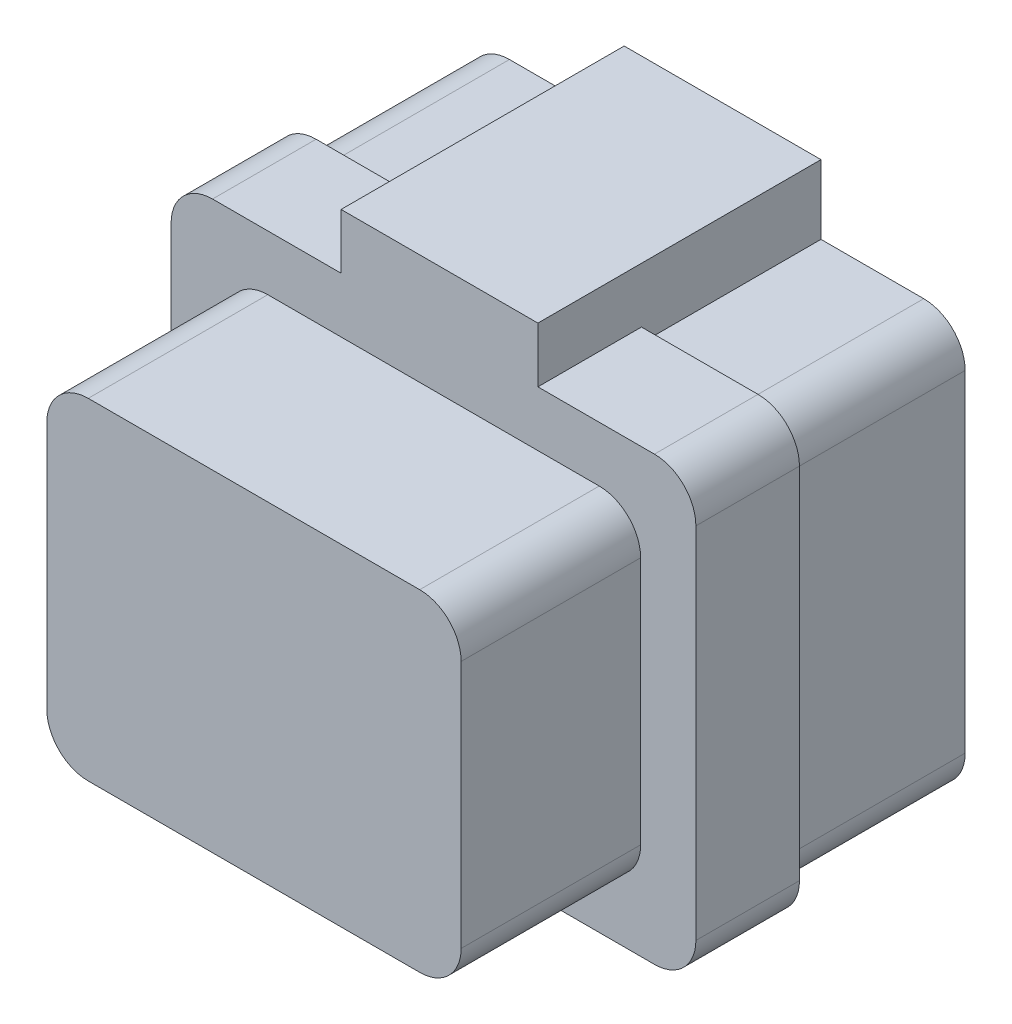
ISO-10303-21;
HEADER;
FILE_DESCRIPTION(('STEP AP214'),'2;1');
FILE_NAME('part.step','',(''),(''),'','','');
FILE_SCHEMA(('AUTOMOTIVE_DESIGN { 1 0 10303 214 1 1 1 1 }'));
ENDSEC;
DATA;
#1=APPLICATION_CONTEXT('core data for automotive mechanical design processes');
#2=APPLICATION_PROTOCOL_DEFINITION('international standard','automotive_design',2000,#1);
#3=PRODUCT_CONTEXT('',#1,'mechanical');
#4=PRODUCT('Part','Part','',(#3));
#5=PRODUCT_RELATED_PRODUCT_CATEGORY('part','',(#4));
#6=PRODUCT_DEFINITION_FORMATION('','',#4);
#7=PRODUCT_DEFINITION_CONTEXT('part definition',#1,'design');
#8=PRODUCT_DEFINITION('design','',#6,#7);
#9=PRODUCT_DEFINITION_SHAPE('','',#8);
#10=(LENGTH_UNIT() NAMED_UNIT(*) SI_UNIT(.MILLI.,.METRE.));
#11=(NAMED_UNIT(*) PLANE_ANGLE_UNIT() SI_UNIT($,.RADIAN.));
#12=(NAMED_UNIT(*) SI_UNIT($,.STERADIAN.) SOLID_ANGLE_UNIT());
#13=UNCERTAINTY_MEASURE_WITH_UNIT(LENGTH_MEASURE(1.E-05),#10,'distance_accuracy_value','');
#14=(GEOMETRIC_REPRESENTATION_CONTEXT(3) GLOBAL_UNCERTAINTY_ASSIGNED_CONTEXT((#13)) GLOBAL_UNIT_ASSIGNED_CONTEXT((#10,
#11,#12)) REPRESENTATION_CONTEXT('',''));
#15=CARTESIAN_POINT('',(0.,0.,0.));
#16=DIRECTION('',(0.,0.,1.));
#17=DIRECTION('',(1.,0.,0.));
#18=AXIS2_PLACEMENT_3D('',#15,#16,#17);
#19=CARTESIAN_POINT('',(0.,0.,0.));
#20=DIRECTION('',(0.,0.,-1.));
#21=DIRECTION('',(-1.,0.,0.));
#22=AXIS2_PLACEMENT_3D('',#19,#20,#21);
#23=PLANE('',#22);
#24=DIRECTION('',(-1.,0.,0.));
#25=VECTOR('',#24,1.);
#26=CARTESIAN_POINT('',(0.,32.,0.));
#27=LINE('',#26,#25);
#28=CARTESIAN_POINT('',(12.3077716505359,32.,0.));
#29=VERTEX_POINT('',#28);
#30=CARTESIAN_POINT('',(3.,32.,0.));
#31=VERTEX_POINT('',#30);
#32=EDGE_CURVE('E342',#29,#31,#27,.T.);
#33=ORIENTED_EDGE('',*,*,#32,.F.);
#34=DIRECTION('',(0.,-1.,0.));
#35=VECTOR('',#34,1.);
#36=CARTESIAN_POINT('',(12.3077716505359,0.,0.));
#37=LINE('',#36,#35);
#38=CARTESIAN_POINT('',(12.3077716505359,31.,0.));
#39=VERTEX_POINT('',#38);
#40=EDGE_CURVE('E267',#29,#39,#37,.T.);
#41=ORIENTED_EDGE('',*,*,#40,.T.);
#42=DIRECTION('',(1.,0.,0.));
#43=VECTOR('',#42,1.);
#44=CARTESIAN_POINT('',(1.,31.,0.));
#45=LINE('',#44,#43);
#46=CARTESIAN_POINT('',(4.,31.,0.));
#47=VERTEX_POINT('',#46);
#48=EDGE_CURVE('E292',#47,#39,#45,.T.);
#49=ORIENTED_EDGE('',*,*,#48,.F.);
#50=CARTESIAN_POINT('',(4.,28.,0.));
#51=DIRECTION('',(0.,0.,-1.));
#52=DIRECTION('',(-1.,0.,0.));
#53=AXIS2_PLACEMENT_3D('',#50,#51,#52);
#54=CIRCLE('',#53,3.);
#55=CARTESIAN_POINT('',(1.,28.,0.));
#56=VERTEX_POINT('',#55);
#57=EDGE_CURVE('E45',#47,#56,#54,.F.);
#58=ORIENTED_EDGE('',*,*,#57,.T.);
#59=DIRECTION('',(0.,1.,0.));
#60=VECTOR('',#59,1.);
#61=CARTESIAN_POINT('',(1.,1.,0.));
#62=LINE('',#61,#60);
#63=CARTESIAN_POINT('',(1.,4.,0.));
#64=VERTEX_POINT('',#63);
#65=EDGE_CURVE('E288',#64,#56,#62,.T.);
#66=ORIENTED_EDGE('',*,*,#65,.F.);
#67=CARTESIAN_POINT('',(4.,4.,0.));
#68=DIRECTION('',(0.,0.,-1.));
#69=DIRECTION('',(-1.,0.,0.));
#70=AXIS2_PLACEMENT_3D('',#67,#68,#69);
#71=CIRCLE('',#70,3.);
#72=CARTESIAN_POINT('',(4.,1.,0.));
#73=VERTEX_POINT('',#72);
#74=EDGE_CURVE('E448',#64,#73,#71,.F.);
#75=ORIENTED_EDGE('',*,*,#74,.T.);
#76=DIRECTION('',(-1.,0.,0.));
#77=VECTOR('',#76,1.);
#78=CARTESIAN_POINT('',(37.,1.,0.));
#79=LINE('',#78,#77);
#80=CARTESIAN_POINT('',(34.,1.,0.));
#81=VERTEX_POINT('',#80);
#82=EDGE_CURVE('E270',#81,#73,#79,.T.);
#83=ORIENTED_EDGE('',*,*,#82,.F.);
#84=CARTESIAN_POINT('',(34.,4.,0.));
#85=DIRECTION('',(0.,0.,-1.));
#86=DIRECTION('',(-1.,0.,0.));
#87=AXIS2_PLACEMENT_3D('',#84,#85,#86);
#88=CIRCLE('',#87,3.);
#89=CARTESIAN_POINT('',(37.,4.,0.));
#90=VERTEX_POINT('',#89);
#91=EDGE_CURVE('E446',#81,#90,#88,.F.);
#92=ORIENTED_EDGE('',*,*,#91,.T.);
#93=DIRECTION('',(0.,-1.,0.));
#94=VECTOR('',#93,1.);
#95=CARTESIAN_POINT('',(37.,31.,0.));
#96=LINE('',#95,#94);
#97=CARTESIAN_POINT('',(37.,28.,0.));
#98=VERTEX_POINT('',#97);
#99=EDGE_CURVE('E275',#98,#90,#96,.T.);
#100=ORIENTED_EDGE('',*,*,#99,.F.);
#101=CARTESIAN_POINT('',(34.,28.,0.));
#102=DIRECTION('',(0.,0.,-1.));
#103=DIRECTION('',(-1.,0.,0.));
#104=AXIS2_PLACEMENT_3D('',#101,#102,#103);
#105=CIRCLE('',#104,3.);
#106=CARTESIAN_POINT('',(34.,31.,0.));
#107=VERTEX_POINT('',#106);
#108=EDGE_CURVE('E11',#98,#107,#105,.F.);
#109=ORIENTED_EDGE('',*,*,#108,.T.);
#110=CARTESIAN_POINT('',(26.5597394318021,31.,0.));
#111=VERTEX_POINT('',#110);
#112=EDGE_CURVE('E291',#111,#107,#45,.T.);
#113=ORIENTED_EDGE('',*,*,#112,.F.);
#114=DIRECTION('',(0.,1.,0.));
#115=VECTOR('',#114,1.);
#116=CARTESIAN_POINT('',(26.5597394318021,0.,0.));
#117=LINE('',#116,#115);
#118=CARTESIAN_POINT('',(26.5597394318021,32.,0.));
#119=VERTEX_POINT('',#118);
#120=EDGE_CURVE('E259',#111,#119,#117,.T.);
#121=ORIENTED_EDGE('',*,*,#120,.T.);
#122=CARTESIAN_POINT('',(35.,32.,0.));
#123=VERTEX_POINT('',#122);
#124=EDGE_CURVE('E325',#123,#119,#27,.T.);
#125=ORIENTED_EDGE('',*,*,#124,.F.);
#126=CARTESIAN_POINT('',(35.,29.,0.));
#127=DIRECTION('',(0.,0.,-1.));
#128=DIRECTION('',(-1.,0.,0.));
#129=AXIS2_PLACEMENT_3D('',#126,#127,#128);
#130=CIRCLE('',#129,3.);
#131=CARTESIAN_POINT('',(38.,29.,0.));
#132=VERTEX_POINT('',#131);
#133=EDGE_CURVE('E395',#123,#132,#130,.T.);
#134=ORIENTED_EDGE('',*,*,#133,.T.);
#135=DIRECTION('',(0.,1.,0.));
#136=VECTOR('',#135,1.);
#137=CARTESIAN_POINT('',(38.,0.,0.));
#138=LINE('',#137,#136);
#139=CARTESIAN_POINT('',(38.,3.,0.));
#140=VERTEX_POINT('',#139);
#141=EDGE_CURVE('E339',#140,#132,#138,.T.);
#142=ORIENTED_EDGE('',*,*,#141,.F.);
#143=CARTESIAN_POINT('',(35.,3.,0.));
#144=DIRECTION('',(0.,0.,-1.));
#145=DIRECTION('',(-1.,0.,0.));
#146=AXIS2_PLACEMENT_3D('',#143,#144,#145);
#147=CIRCLE('',#146,3.);
#148=CARTESIAN_POINT('',(35.,0.,0.));
#149=VERTEX_POINT('',#148);
#150=EDGE_CURVE('E402',#140,#149,#147,.T.);
#151=ORIENTED_EDGE('',*,*,#150,.T.);
#152=DIRECTION('',(1.,0.,0.));
#153=VECTOR('',#152,1.);
#154=CARTESIAN_POINT('',(0.,0.,0.));
#155=LINE('',#154,#153);
#156=CARTESIAN_POINT('',(3.,0.,0.));
#157=VERTEX_POINT('',#156);
#158=EDGE_CURVE('E336',#157,#149,#155,.T.);
#159=ORIENTED_EDGE('',*,*,#158,.F.);
#160=CARTESIAN_POINT('',(3.,3.,0.));
#161=DIRECTION('',(0.,0.,-1.));
#162=DIRECTION('',(-1.,0.,0.));
#163=AXIS2_PLACEMENT_3D('',#160,#161,#162);
#164=CIRCLE('',#163,3.);
#165=CARTESIAN_POINT('',(0.,3.,0.));
#166=VERTEX_POINT('',#165);
#167=EDGE_CURVE('E400',#157,#166,#164,.T.);
#168=ORIENTED_EDGE('',*,*,#167,.T.);
#169=DIRECTION('',(0.,-1.,0.));
#170=VECTOR('',#169,1.);
#171=CARTESIAN_POINT('',(0.,0.,0.));
#172=LINE('',#171,#170);
#173=CARTESIAN_POINT('',(0.,29.,0.));
#174=VERTEX_POINT('',#173);
#175=EDGE_CURVE('E310',#174,#166,#172,.T.);
#176=ORIENTED_EDGE('',*,*,#175,.F.);
#177=CARTESIAN_POINT('',(3.,29.,0.));
#178=DIRECTION('',(0.,0.,-1.));
#179=DIRECTION('',(-1.,0.,0.));
#180=AXIS2_PLACEMENT_3D('',#177,#178,#179);
#181=CIRCLE('',#180,3.);
#182=EDGE_CURVE('E397',#174,#31,#181,.T.);
#183=ORIENTED_EDGE('',*,*,#182,.T.);
#184=EDGE_LOOP('',(#33,#41,#49,#58,#66,#75,#83,#92,#100,#109,#113,#121,#125,#134,#142,#151,#159,
#168,#176,#183));
#185=FACE_BOUND('',#184,.T.);
#186=ADVANCED_FACE('F37',(#185),#23,.T.);
#187=CARTESIAN_POINT('',(0.,32.,7.5));
#188=DIRECTION('',(0.,-1.,0.));
#189=DIRECTION('',(0.,0.,-1.));
#190=AXIS2_PLACEMENT_3D('',#187,#188,#189);
#191=PLANE('',#190);
#192=DIRECTION('',(0.,0.,1.));
#193=VECTOR('',#192,1.);
#194=CARTESIAN_POINT('',(12.3077716505359,32.,7.5));
#195=LINE('',#194,#193);
#196=CARTESIAN_POINT('',(12.3077716505359,32.,7.5));
#197=VERTEX_POINT('',#196);
#198=EDGE_CURVE('E256',#29,#197,#195,.T.);
#199=ORIENTED_EDGE('',*,*,#198,.F.);
#200=ORIENTED_EDGE('',*,*,#32,.T.);
#201=DIRECTION('',(0.,0.,-1.));
#202=VECTOR('',#201,1.);
#203=CARTESIAN_POINT('',(3.,32.,7.5));
#204=LINE('',#203,#202);
#205=CARTESIAN_POINT('',(3.,32.,7.5));
#206=VERTEX_POINT('',#205);
#207=EDGE_CURVE('E430',#31,#206,#204,.F.);
#208=ORIENTED_EDGE('',*,*,#207,.T.);
#209=DIRECTION('',(-1.,0.,0.));
#210=VECTOR('',#209,1.);
#211=CARTESIAN_POINT('',(0.,32.,7.5));
#212=LINE('',#211,#210);
#213=EDGE_CURVE('E60',#197,#206,#212,.T.);
#214=ORIENTED_EDGE('',*,*,#213,.F.);
#215=EDGE_LOOP('',(#199,#200,#208,#214));
#216=FACE_BOUND('',#215,.T.);
#217=ADVANCED_FACE('F499',(#216),#191,.F.);
#218=DIRECTION('',(0.,0.,-1.));
#219=VECTOR('',#218,1.);
#220=CARTESIAN_POINT('',(26.5597394318021,32.,7.5));
#221=LINE('',#220,#219);
#222=CARTESIAN_POINT('',(26.5597394318021,32.,7.5));
#223=VERTEX_POINT('',#222);
#224=EDGE_CURVE('E257',#223,#119,#221,.T.);
#225=ORIENTED_EDGE('',*,*,#224,.F.);
#226=CARTESIAN_POINT('',(35.,32.,7.5));
#227=VERTEX_POINT('',#226);
#228=EDGE_CURVE('E331',#227,#223,#212,.T.);
#229=ORIENTED_EDGE('',*,*,#228,.F.);
#230=DIRECTION('',(0.,0.,-1.));
#231=VECTOR('',#230,1.);
#232=CARTESIAN_POINT('',(35.,32.,7.5));
#233=LINE('',#232,#231);
#234=EDGE_CURVE('E427',#227,#123,#233,.T.);
#235=ORIENTED_EDGE('',*,*,#234,.T.);
#236=ORIENTED_EDGE('',*,*,#124,.T.);
#237=EDGE_LOOP('',(#225,#229,#235,#236));
#238=FACE_BOUND('',#237,.T.);
#239=ADVANCED_FACE('F504',(#238),#191,.F.);
#240=CARTESIAN_POINT('',(1.,31.,-13.));
#241=DIRECTION('',(0.,-1.,0.));
#242=DIRECTION('',(0.,0.,-1.));
#243=AXIS2_PLACEMENT_3D('',#240,#241,#242);
#244=PLANE('',#243);
#245=DIRECTION('',(0.,0.,1.));
#246=VECTOR('',#245,1.);
#247=CARTESIAN_POINT('',(12.3077716505359,31.,-13.));
#248=LINE('',#247,#246);
#249=CARTESIAN_POINT('',(12.3077716505359,31.,-13.));
#250=VERTEX_POINT('',#249);
#251=EDGE_CURVE('E467',#250,#39,#248,.T.);
#252=ORIENTED_EDGE('',*,*,#251,.F.);
#253=DIRECTION('',(1.,0.,0.));
#254=VECTOR('',#253,1.);
#255=CARTESIAN_POINT('',(1.,31.,-13.));
#256=LINE('',#255,#254);
#257=CARTESIAN_POINT('',(4.,31.,-13.));
#258=VERTEX_POINT('',#257);
#259=EDGE_CURVE('E279',#258,#250,#256,.T.);
#260=ORIENTED_EDGE('',*,*,#259,.F.);
#261=DIRECTION('',(0.,0.,1.));
#262=VECTOR('',#261,1.);
#263=CARTESIAN_POINT('',(4.,31.,-13.));
#264=LINE('',#263,#262);
#265=EDGE_CURVE('E435',#258,#47,#264,.T.);
#266=ORIENTED_EDGE('',*,*,#265,.T.);
#267=ORIENTED_EDGE('',*,*,#48,.T.);
#268=EDGE_LOOP('',(#252,#260,#266,#267));
#269=FACE_BOUND('',#268,.T.);
#270=ADVANCED_FACE('F466',(#269),#244,.F.);
#271=DIRECTION('',(0.,0.,-1.));
#272=VECTOR('',#271,1.);
#273=CARTESIAN_POINT('',(26.5597394318021,31.,-13.));
#274=LINE('',#273,#272);
#275=CARTESIAN_POINT('',(26.5597394318021,31.,-13.));
#276=VERTEX_POINT('',#275);
#277=EDGE_CURVE('E252',#111,#276,#274,.T.);
#278=ORIENTED_EDGE('',*,*,#277,.F.);
#279=ORIENTED_EDGE('',*,*,#112,.T.);
#280=DIRECTION('',(0.,0.,1.));
#281=VECTOR('',#280,1.);
#282=CARTESIAN_POINT('',(34.,31.,-13.));
#283=LINE('',#282,#281);
#284=CARTESIAN_POINT('',(34.,31.,-13.));
#285=VERTEX_POINT('',#284);
#286=EDGE_CURVE('E432',#107,#285,#283,.F.);
#287=ORIENTED_EDGE('',*,*,#286,.T.);
#288=EDGE_CURVE('E278',#276,#285,#256,.T.);
#289=ORIENTED_EDGE('',*,*,#288,.F.);
#290=EDGE_LOOP('',(#278,#279,#287,#289));
#291=FACE_BOUND('',#290,.T.);
#292=ADVANCED_FACE('F581',(#291),#244,.F.);
#293=CARTESIAN_POINT('',(0.,0.,7.5));
#294=DIRECTION('',(0.,0.,-1.));
#295=DIRECTION('',(-1.,0.,0.));
#296=AXIS2_PLACEMENT_3D('',#293,#294,#295);
#297=PLANE('',#296);
#298=ORIENTED_EDGE('',*,*,#228,.T.);
#299=DIRECTION('',(0.,-1.,0.));
#300=VECTOR('',#299,1.);
#301=CARTESIAN_POINT('',(26.5597394318021,36.,7.5));
#302=LINE('',#301,#300);
#303=CARTESIAN_POINT('',(26.5597394318021,36.,7.5));
#304=VERTEX_POINT('',#303);
#305=EDGE_CURVE('E241',#304,#223,#302,.T.);
#306=ORIENTED_EDGE('',*,*,#305,.F.);
#307=DIRECTION('',(1.,0.,0.));
#308=VECTOR('',#307,1.);
#309=CARTESIAN_POINT('',(12.3077716505359,36.,7.5));
#310=LINE('',#309,#308);
#311=CARTESIAN_POINT('',(12.3077716505359,36.,7.5));
#312=VERTEX_POINT('',#311);
#313=EDGE_CURVE('E234',#312,#304,#310,.T.);
#314=ORIENTED_EDGE('',*,*,#313,.F.);
#315=DIRECTION('',(0.,-1.,0.));
#316=VECTOR('',#315,1.);
#317=CARTESIAN_POINT('',(12.3077716505359,36.,7.5));
#318=LINE('',#317,#316);
#319=EDGE_CURVE('E240',#312,#197,#318,.T.);
#320=ORIENTED_EDGE('',*,*,#319,.T.);
#321=ORIENTED_EDGE('',*,*,#213,.T.);
#322=CARTESIAN_POINT('',(3.,29.,7.5));
#323=DIRECTION('',(0.,0.,-1.));
#324=DIRECTION('',(-1.,0.,0.));
#325=AXIS2_PLACEMENT_3D('',#322,#323,#324);
#326=CIRCLE('',#325,3.);
#327=CARTESIAN_POINT('',(0.,29.,7.5));
#328=VERTEX_POINT('',#327);
#329=EDGE_CURVE('E411',#206,#328,#326,.F.);
#330=ORIENTED_EDGE('',*,*,#329,.T.);
#331=DIRECTION('',(0.,-1.,0.));
#332=VECTOR('',#331,1.);
#333=CARTESIAN_POINT('',(0.,0.,7.5));
#334=LINE('',#333,#332);
#335=CARTESIAN_POINT('',(0.,3.,7.5));
#336=VERTEX_POINT('',#335);
#337=EDGE_CURVE('E321',#328,#336,#334,.T.);
#338=ORIENTED_EDGE('',*,*,#337,.T.);
#339=CARTESIAN_POINT('',(3.,3.,7.5));
#340=DIRECTION('',(0.,0.,-1.));
#341=DIRECTION('',(-1.,0.,0.));
#342=AXIS2_PLACEMENT_3D('',#339,#340,#341);
#343=CIRCLE('',#342,3.);
#344=CARTESIAN_POINT('',(3.,0.,7.5));
#345=VERTEX_POINT('',#344);
#346=EDGE_CURVE('E413',#336,#345,#343,.F.);
#347=ORIENTED_EDGE('',*,*,#346,.T.);
#348=DIRECTION('',(1.,0.,0.));
#349=VECTOR('',#348,1.);
#350=CARTESIAN_POINT('',(0.,0.,7.5));
#351=LINE('',#350,#349);
#352=CARTESIAN_POINT('',(35.,0.,7.5));
#353=VERTEX_POINT('',#352);
#354=EDGE_CURVE('E324',#345,#353,#351,.T.);
#355=ORIENTED_EDGE('',*,*,#354,.T.);
#356=CARTESIAN_POINT('',(35.,3.,7.5));
#357=DIRECTION('',(0.,0.,-1.));
#358=DIRECTION('',(-1.,0.,0.));
#359=AXIS2_PLACEMENT_3D('',#356,#357,#358);
#360=CIRCLE('',#359,3.);
#361=CARTESIAN_POINT('',(38.,3.,7.5));
#362=VERTEX_POINT('',#361);
#363=EDGE_CURVE('E415',#353,#362,#360,.F.);
#364=ORIENTED_EDGE('',*,*,#363,.T.);
#365=DIRECTION('',(0.,1.,0.));
#366=VECTOR('',#365,1.);
#367=CARTESIAN_POINT('',(38.,0.,7.5));
#368=LINE('',#367,#366);
#369=CARTESIAN_POINT('',(38.,29.,7.5));
#370=VERTEX_POINT('',#369);
#371=EDGE_CURVE('E328',#362,#370,#368,.T.);
#372=ORIENTED_EDGE('',*,*,#371,.T.);
#373=CARTESIAN_POINT('',(35.,29.,7.5));
#374=DIRECTION('',(0.,0.,-1.));
#375=DIRECTION('',(-1.,0.,0.));
#376=AXIS2_PLACEMENT_3D('',#373,#374,#375);
#377=CIRCLE('',#376,3.);
#378=EDGE_CURVE('E409',#370,#227,#377,.F.);
#379=ORIENTED_EDGE('',*,*,#378,.T.);
#380=EDGE_LOOP('',(#298,#306,#314,#320,#321,#330,#338,#347,#355,#364,#372,#379));
#381=FACE_BOUND('',#380,.T.);
#382=DIRECTION('',(-1.,0.,0.));
#383=VECTOR('',#382,1.);
#384=CARTESIAN_POINT('',(34.,28.,7.5));
#385=LINE('',#384,#383);
#386=CARTESIAN_POINT('',(31.,28.,7.5));
#387=VERTEX_POINT('',#386);
#388=CARTESIAN_POINT('',(7.00000000000001,28.,7.5));
#389=VERTEX_POINT('',#388);
#390=EDGE_CURVE('E285',#387,#389,#385,.T.);
#391=ORIENTED_EDGE('',*,*,#390,.F.);
#392=CARTESIAN_POINT('',(31.,25.,7.5));
#393=DIRECTION('',(0.,0.,-1.));
#394=DIRECTION('',(-1.,0.,0.));
#395=AXIS2_PLACEMENT_3D('',#392,#393,#394);
#396=CIRCLE('',#395,3.);
#397=CARTESIAN_POINT('',(34.,25.,7.5));
#398=VERTEX_POINT('',#397);
#399=EDGE_CURVE('E444',#387,#398,#396,.T.);
#400=ORIENTED_EDGE('',*,*,#399,.T.);
#401=DIRECTION('',(0.,1.,0.));
#402=VECTOR('',#401,1.);
#403=CARTESIAN_POINT('',(34.,4.,7.5));
#404=LINE('',#403,#402);
#405=CARTESIAN_POINT('',(34.,7.,7.5));
#406=VERTEX_POINT('',#405);
#407=EDGE_CURVE('E301',#406,#398,#404,.T.);
#408=ORIENTED_EDGE('',*,*,#407,.F.);
#409=CARTESIAN_POINT('',(31.,7.,7.5));
#410=DIRECTION('',(0.,0.,-1.));
#411=DIRECTION('',(-1.,0.,0.));
#412=AXIS2_PLACEMENT_3D('',#409,#410,#411);
#413=CIRCLE('',#412,3.);
#414=CARTESIAN_POINT('',(31.,4.,7.5));
#415=VERTEX_POINT('',#414);
#416=EDGE_CURVE('E438',#406,#415,#413,.T.);
#417=ORIENTED_EDGE('',*,*,#416,.T.);
#418=DIRECTION('',(1.,0.,0.));
#419=VECTOR('',#418,1.);
#420=CARTESIAN_POINT('',(4.,4.,7.5));
#421=LINE('',#420,#419);
#422=CARTESIAN_POINT('',(7.,4.,7.5));
#423=VERTEX_POINT('',#422);
#424=EDGE_CURVE('E316',#423,#415,#421,.T.);
#425=ORIENTED_EDGE('',*,*,#424,.F.);
#426=CARTESIAN_POINT('',(7.,7.,7.5));
#427=DIRECTION('',(0.,0.,-1.));
#428=DIRECTION('',(-1.,0.,0.));
#429=AXIS2_PLACEMENT_3D('',#426,#427,#428);
#430=CIRCLE('',#429,3.);
#431=CARTESIAN_POINT('',(4.,7.,7.5));
#432=VERTEX_POINT('',#431);
#433=EDGE_CURVE('E440',#423,#432,#430,.T.);
#434=ORIENTED_EDGE('',*,*,#433,.T.);
#435=DIRECTION('',(0.,-1.,0.));
#436=VECTOR('',#435,1.);
#437=CARTESIAN_POINT('',(4.,28.,7.5));
#438=LINE('',#437,#436);
#439=CARTESIAN_POINT('',(4.,25.,7.5));
#440=VERTEX_POINT('',#439);
#441=EDGE_CURVE('E313',#440,#432,#438,.T.);
#442=ORIENTED_EDGE('',*,*,#441,.F.);
#443=CARTESIAN_POINT('',(7.,25.,7.5));
#444=DIRECTION('',(0.,0.,-1.));
#445=DIRECTION('',(-1.,0.,0.));
#446=AXIS2_PLACEMENT_3D('',#443,#444,#445);
#447=CIRCLE('',#446,3.);
#448=EDGE_CURVE('E442',#440,#389,#447,.T.);
#449=ORIENTED_EDGE('',*,*,#448,.T.);
#450=EDGE_LOOP('',(#391,#400,#408,#417,#425,#434,#442,#449));
#451=FACE_BOUND('',#450,.T.);
#452=ADVANCED_FACE('F237',(#381,#451),#297,.F.);
#453=CARTESIAN_POINT('',(0.,0.,7.5));
#454=DIRECTION('',(1.,0.,0.));
#455=DIRECTION('',(0.,0.,-1.));
#456=AXIS2_PLACEMENT_3D('',#453,#454,#455);
#457=PLANE('',#456);
#458=ORIENTED_EDGE('',*,*,#175,.T.);
#459=DIRECTION('',(0.,0.,-1.));
#460=VECTOR('',#459,1.);
#461=CARTESIAN_POINT('',(0.,3.,7.5));
#462=LINE('',#461,#460);
#463=EDGE_CURVE('E420',#166,#336,#462,.F.);
#464=ORIENTED_EDGE('',*,*,#463,.T.);
#465=ORIENTED_EDGE('',*,*,#337,.F.);
#466=DIRECTION('',(0.,0.,-1.));
#467=VECTOR('',#466,1.);
#468=CARTESIAN_POINT('',(0.,29.,7.5));
#469=LINE('',#468,#467);
#470=EDGE_CURVE('E417',#328,#174,#469,.T.);
#471=ORIENTED_EDGE('',*,*,#470,.T.);
#472=EDGE_LOOP('',(#458,#464,#465,#471));
#473=FACE_BOUND('',#472,.T.);
#474=ADVANCED_FACE('F518',(#473),#457,.F.);
#475=CARTESIAN_POINT('',(0.,0.,7.5));
#476=DIRECTION('',(0.,1.,0.));
#477=DIRECTION('',(0.,0.,1.));
#478=AXIS2_PLACEMENT_3D('',#475,#476,#477);
#479=PLANE('',#478);
#480=ORIENTED_EDGE('',*,*,#158,.T.);
#481=DIRECTION('',(0.,0.,-1.));
#482=VECTOR('',#481,1.);
#483=CARTESIAN_POINT('',(35.,0.,7.5));
#484=LINE('',#483,#482);
#485=EDGE_CURVE('E407',#149,#353,#484,.F.);
#486=ORIENTED_EDGE('',*,*,#485,.T.);
#487=ORIENTED_EDGE('',*,*,#354,.F.);
#488=DIRECTION('',(0.,0.,-1.));
#489=VECTOR('',#488,1.);
#490=CARTESIAN_POINT('',(3.,0.,7.5));
#491=LINE('',#490,#489);
#492=EDGE_CURVE('E404',#345,#157,#491,.T.);
#493=ORIENTED_EDGE('',*,*,#492,.T.);
#494=EDGE_LOOP('',(#480,#486,#487,#493));
#495=FACE_BOUND('',#494,.T.);
#496=ADVANCED_FACE('F514',(#495),#479,.F.);
#497=CARTESIAN_POINT('',(38.,0.,7.5));
#498=DIRECTION('',(-1.,0.,0.));
#499=DIRECTION('',(0.,0.,1.));
#500=AXIS2_PLACEMENT_3D('',#497,#498,#499);
#501=PLANE('',#500);
#502=ORIENTED_EDGE('',*,*,#371,.F.);
#503=DIRECTION('',(0.,0.,-1.));
#504=VECTOR('',#503,1.);
#505=CARTESIAN_POINT('',(38.,3.,7.5));
#506=LINE('',#505,#504);
#507=EDGE_CURVE('E392',#362,#140,#506,.T.);
#508=ORIENTED_EDGE('',*,*,#507,.T.);
#509=ORIENTED_EDGE('',*,*,#141,.T.);
#510=DIRECTION('',(0.,0.,-1.));
#511=VECTOR('',#510,1.);
#512=CARTESIAN_POINT('',(38.,29.,7.5));
#513=LINE('',#512,#511);
#514=EDGE_CURVE('E390',#132,#370,#513,.F.);
#515=ORIENTED_EDGE('',*,*,#514,.T.);
#516=EDGE_LOOP('',(#502,#508,#509,#515));
#517=FACE_BOUND('',#516,.T.);
#518=ADVANCED_FACE('F510',(#517),#501,.F.);
#519=CARTESIAN_POINT('',(34.,28.,20.5));
#520=DIRECTION('',(0.,-1.,0.));
#521=DIRECTION('',(0.,0.,-1.));
#522=AXIS2_PLACEMENT_3D('',#519,#520,#521);
#523=PLANE('',#522);
#524=ORIENTED_EDGE('',*,*,#390,.T.);
#525=DIRECTION('',(0.,0.,-1.));
#526=VECTOR('',#525,1.);
#527=CARTESIAN_POINT('',(7.,28.,20.5));
#528=LINE('',#527,#526);
#529=CARTESIAN_POINT('',(7.00000000000001,28.,20.5));
#530=VERTEX_POINT('',#529);
#531=EDGE_CURVE('E370',#389,#530,#528,.F.);
#532=ORIENTED_EDGE('',*,*,#531,.T.);
#533=DIRECTION('',(-1.,0.,0.));
#534=VECTOR('',#533,1.);
#535=CARTESIAN_POINT('',(34.,28.,20.5));
#536=LINE('',#535,#534);
#537=CARTESIAN_POINT('',(31.,28.,20.5));
#538=VERTEX_POINT('',#537);
#539=EDGE_CURVE('E297',#538,#530,#536,.T.);
#540=ORIENTED_EDGE('',*,*,#539,.F.);
#541=DIRECTION('',(0.,0.,-1.));
#542=VECTOR('',#541,1.);
#543=CARTESIAN_POINT('',(31.,28.,20.5));
#544=LINE('',#543,#542);
#545=EDGE_CURVE('E367',#538,#387,#544,.T.);
#546=ORIENTED_EDGE('',*,*,#545,.T.);
#547=EDGE_LOOP('',(#524,#532,#540,#546));
#548=FACE_BOUND('',#547,.T.);
#549=ADVANCED_FACE('F513',(#548),#523,.F.);
#550=CARTESIAN_POINT('',(4.,28.,20.5));
#551=DIRECTION('',(1.,0.,0.));
#552=DIRECTION('',(0.,0.,-1.));
#553=AXIS2_PLACEMENT_3D('',#550,#551,#552);
#554=PLANE('',#553);
#555=ORIENTED_EDGE('',*,*,#441,.T.);
#556=DIRECTION('',(0.,0.,-1.));
#557=VECTOR('',#556,1.);
#558=CARTESIAN_POINT('',(4.,7.,20.5));
#559=LINE('',#558,#557);
#560=CARTESIAN_POINT('',(4.,7.,20.5));
#561=VERTEX_POINT('',#560);
#562=EDGE_CURVE('E365',#432,#561,#559,.F.);
#563=ORIENTED_EDGE('',*,*,#562,.T.);
#564=DIRECTION('',(0.,-1.,0.));
#565=VECTOR('',#564,1.);
#566=CARTESIAN_POINT('',(4.,28.,20.5));
#567=LINE('',#566,#565);
#568=CARTESIAN_POINT('',(4.,25.,20.5));
#569=VERTEX_POINT('',#568);
#570=EDGE_CURVE('E300',#569,#561,#567,.T.);
#571=ORIENTED_EDGE('',*,*,#570,.F.);
#572=DIRECTION('',(0.,0.,-1.));
#573=VECTOR('',#572,1.);
#574=CARTESIAN_POINT('',(4.,25.,20.5));
#575=LINE('',#574,#573);
#576=EDGE_CURVE('E362',#569,#440,#575,.T.);
#577=ORIENTED_EDGE('',*,*,#576,.T.);
#578=EDGE_LOOP('',(#555,#563,#571,#577));
#579=FACE_BOUND('',#578,.T.);
#580=ADVANCED_FACE('F629',(#579),#554,.F.);
#581=CARTESIAN_POINT('',(4.,4.,20.5));
#582=DIRECTION('',(0.,1.,0.));
#583=DIRECTION('',(0.,0.,1.));
#584=AXIS2_PLACEMENT_3D('',#581,#582,#583);
#585=PLANE('',#584);
#586=ORIENTED_EDGE('',*,*,#424,.T.);
#587=DIRECTION('',(0.,0.,-1.));
#588=VECTOR('',#587,1.);
#589=CARTESIAN_POINT('',(31.,4.,20.5));
#590=LINE('',#589,#588);
#591=CARTESIAN_POINT('',(31.,4.,20.5));
#592=VERTEX_POINT('',#591);
#593=EDGE_CURVE('E352',#415,#592,#590,.F.);
#594=ORIENTED_EDGE('',*,*,#593,.T.);
#595=DIRECTION('',(1.,0.,0.));
#596=VECTOR('',#595,1.);
#597=CARTESIAN_POINT('',(4.,4.,20.5));
#598=LINE('',#597,#596);
#599=CARTESIAN_POINT('',(7.,4.,20.5));
#600=VERTEX_POINT('',#599);
#601=EDGE_CURVE('E304',#600,#592,#598,.T.);
#602=ORIENTED_EDGE('',*,*,#601,.F.);
#603=DIRECTION('',(0.,0.,-1.));
#604=VECTOR('',#603,1.);
#605=CARTESIAN_POINT('',(7.,4.,20.5));
#606=LINE('',#605,#604);
#607=EDGE_CURVE('E349',#600,#423,#606,.T.);
#608=ORIENTED_EDGE('',*,*,#607,.T.);
#609=EDGE_LOOP('',(#586,#594,#602,#608));
#610=FACE_BOUND('',#609,.T.);
#611=ADVANCED_FACE('F625',(#610),#585,.F.);
#612=CARTESIAN_POINT('',(34.,4.,20.5));
#613=DIRECTION('',(-1.,0.,0.));
#614=DIRECTION('',(0.,0.,1.));
#615=AXIS2_PLACEMENT_3D('',#612,#613,#614);
#616=PLANE('',#615);
#617=DIRECTION('',(0.,1.,0.));
#618=VECTOR('',#617,1.);
#619=CARTESIAN_POINT('',(34.,4.,20.5));
#620=LINE('',#619,#618);
#621=CARTESIAN_POINT('',(34.,7.,20.5));
#622=VERTEX_POINT('',#621);
#623=CARTESIAN_POINT('',(34.,25.,20.5));
#624=VERTEX_POINT('',#623);
#625=EDGE_CURVE('E307',#622,#624,#620,.T.);
#626=ORIENTED_EDGE('',*,*,#625,.F.);
#627=DIRECTION('',(0.,0.,-1.));
#628=VECTOR('',#627,1.);
#629=CARTESIAN_POINT('',(34.,7.,20.5));
#630=LINE('',#629,#628);
#631=EDGE_CURVE('E346',#622,#406,#630,.T.);
#632=ORIENTED_EDGE('',*,*,#631,.T.);
#633=ORIENTED_EDGE('',*,*,#407,.T.);
#634=DIRECTION('',(0.,0.,-1.));
#635=VECTOR('',#634,1.);
#636=CARTESIAN_POINT('',(34.,25.,20.5));
#637=LINE('',#636,#635);
#638=EDGE_CURVE('E333',#398,#624,#637,.F.);
#639=ORIENTED_EDGE('',*,*,#638,.T.);
#640=EDGE_LOOP('',(#626,#632,#633,#639));
#641=FACE_BOUND('',#640,.T.);
#642=ADVANCED_FACE('F621',(#641),#616,.F.);
#643=CARTESIAN_POINT('',(0.,0.,20.5));
#644=DIRECTION('',(0.,0.,1.));
#645=DIRECTION('',(1.,0.,0.));
#646=AXIS2_PLACEMENT_3D('',#643,#644,#645);
#647=PLANE('',#646);
#648=ORIENTED_EDGE('',*,*,#601,.T.);
#649=CARTESIAN_POINT('',(31.,7.,20.5));
#650=DIRECTION('',(0.,0.,1.));
#651=DIRECTION('',(1.,0.,0.));
#652=AXIS2_PLACEMENT_3D('',#649,#650,#651);
#653=CIRCLE('',#652,3.);
#654=EDGE_CURVE('E360',#592,#622,#653,.T.);
#655=ORIENTED_EDGE('',*,*,#654,.T.);
#656=ORIENTED_EDGE('',*,*,#625,.T.);
#657=CARTESIAN_POINT('',(31.,25.,20.5));
#658=DIRECTION('',(0.,0.,1.));
#659=DIRECTION('',(1.,0.,0.));
#660=AXIS2_PLACEMENT_3D('',#657,#658,#659);
#661=CIRCLE('',#660,3.);
#662=EDGE_CURVE('E354',#624,#538,#661,.T.);
#663=ORIENTED_EDGE('',*,*,#662,.T.);
#664=ORIENTED_EDGE('',*,*,#539,.T.);
#665=CARTESIAN_POINT('',(7.,25.,20.5));
#666=DIRECTION('',(0.,0.,1.));
#667=DIRECTION('',(1.,0.,0.));
#668=AXIS2_PLACEMENT_3D('',#665,#666,#667);
#669=CIRCLE('',#668,3.);
#670=EDGE_CURVE('E356',#530,#569,#669,.T.);
#671=ORIENTED_EDGE('',*,*,#670,.T.);
#672=ORIENTED_EDGE('',*,*,#570,.T.);
#673=CARTESIAN_POINT('',(7.,7.,20.5));
#674=DIRECTION('',(0.,0.,1.));
#675=DIRECTION('',(1.,0.,0.));
#676=AXIS2_PLACEMENT_3D('',#673,#674,#675);
#677=CIRCLE('',#676,3.);
#678=EDGE_CURVE('E358',#561,#600,#677,.T.);
#679=ORIENTED_EDGE('',*,*,#678,.T.);
#680=EDGE_LOOP('',(#648,#655,#656,#663,#664,#671,#672,#679));
#681=FACE_BOUND('',#680,.T.);
#682=ADVANCED_FACE('F618',(#681),#647,.T.);
#683=CARTESIAN_POINT('',(37.,1.,-13.));
#684=DIRECTION('',(0.,1.,0.));
#685=DIRECTION('',(0.,0.,1.));
#686=AXIS2_PLACEMENT_3D('',#683,#684,#685);
#687=PLANE('',#686);
#688=DIRECTION('',(-1.,0.,0.));
#689=VECTOR('',#688,1.);
#690=CARTESIAN_POINT('',(37.,1.,-13.));
#691=LINE('',#690,#689);
#692=CARTESIAN_POINT('',(34.,1.,-13.));
#693=VERTEX_POINT('',#692);
#694=CARTESIAN_POINT('',(4.,1.,-13.));
#695=VERTEX_POINT('',#694);
#696=EDGE_CURVE('E271',#693,#695,#691,.T.);
#697=ORIENTED_EDGE('',*,*,#696,.F.);
#698=DIRECTION('',(0.,0.,1.));
#699=VECTOR('',#698,1.);
#700=CARTESIAN_POINT('',(34.,1.,-13.));
#701=LINE('',#700,#699);
#702=EDGE_CURVE('E374',#693,#81,#701,.T.);
#703=ORIENTED_EDGE('',*,*,#702,.T.);
#704=ORIENTED_EDGE('',*,*,#82,.T.);
#705=DIRECTION('',(0.,0.,1.));
#706=VECTOR('',#705,1.);
#707=CARTESIAN_POINT('',(4.,1.,-13.));
#708=LINE('',#707,#706);
#709=EDGE_CURVE('E372',#73,#695,#708,.F.);
#710=ORIENTED_EDGE('',*,*,#709,.T.);
#711=EDGE_LOOP('',(#697,#703,#704,#710));
#712=FACE_BOUND('',#711,.T.);
#713=ADVANCED_FACE('F574',(#712),#687,.F.);
#714=CARTESIAN_POINT('',(1.,1.,-13.));
#715=DIRECTION('',(1.,0.,0.));
#716=DIRECTION('',(0.,0.,-1.));
#717=AXIS2_PLACEMENT_3D('',#714,#715,#716);
#718=PLANE('',#717);
#719=DIRECTION('',(0.,1.,0.));
#720=VECTOR('',#719,1.);
#721=CARTESIAN_POINT('',(1.,1.,-13.));
#722=LINE('',#721,#720);
#723=CARTESIAN_POINT('',(1.,4.,-13.));
#724=VERTEX_POINT('',#723);
#725=CARTESIAN_POINT('',(1.,28.,-13.));
#726=VERTEX_POINT('',#725);
#727=EDGE_CURVE('E274',#724,#726,#722,.T.);
#728=ORIENTED_EDGE('',*,*,#727,.F.);
#729=DIRECTION('',(0.,0.,1.));
#730=VECTOR('',#729,1.);
#731=CARTESIAN_POINT('',(1.,4.,-13.));
#732=LINE('',#731,#730);
#733=EDGE_CURVE('E424',#724,#64,#732,.T.);
#734=ORIENTED_EDGE('',*,*,#733,.T.);
#735=ORIENTED_EDGE('',*,*,#65,.T.);
#736=DIRECTION('',(0.,0.,1.));
#737=VECTOR('',#736,1.);
#738=CARTESIAN_POINT('',(1.,28.,-13.));
#739=LINE('',#738,#737);
#740=EDGE_CURVE('E422',#56,#726,#739,.F.);
#741=ORIENTED_EDGE('',*,*,#740,.T.);
#742=EDGE_LOOP('',(#728,#734,#735,#741));
#743=FACE_BOUND('',#742,.T.);
#744=ADVANCED_FACE('F458',(#743),#718,.F.);
#745=CARTESIAN_POINT('',(37.,31.,-13.));
#746=DIRECTION('',(-1.,0.,0.));
#747=DIRECTION('',(0.,0.,1.));
#748=AXIS2_PLACEMENT_3D('',#745,#746,#747);
#749=PLANE('',#748);
#750=ORIENTED_EDGE('',*,*,#99,.T.);
#751=DIRECTION('',(0.,0.,1.));
#752=VECTOR('',#751,1.);
#753=CARTESIAN_POINT('',(37.,4.,-13.));
#754=LINE('',#753,#752);
#755=CARTESIAN_POINT('',(37.,4.,-13.));
#756=VERTEX_POINT('',#755);
#757=EDGE_CURVE('E380',#90,#756,#754,.F.);
#758=ORIENTED_EDGE('',*,*,#757,.T.);
#759=DIRECTION('',(0.,-1.,0.));
#760=VECTOR('',#759,1.);
#761=CARTESIAN_POINT('',(37.,31.,-13.));
#762=LINE('',#761,#760);
#763=CARTESIAN_POINT('',(37.,28.,-13.));
#764=VERTEX_POINT('',#763);
#765=EDGE_CURVE('E282',#764,#756,#762,.T.);
#766=ORIENTED_EDGE('',*,*,#765,.F.);
#767=DIRECTION('',(0.,0.,1.));
#768=VECTOR('',#767,1.);
#769=CARTESIAN_POINT('',(37.,28.,-13.));
#770=LINE('',#769,#768);
#771=EDGE_CURVE('E377',#764,#98,#770,.T.);
#772=ORIENTED_EDGE('',*,*,#771,.T.);
#773=EDGE_LOOP('',(#750,#758,#766,#772));
#774=FACE_BOUND('',#773,.T.);
#775=ADVANCED_FACE('F486',(#774),#749,.F.);
#776=CARTESIAN_POINT('',(0.,0.,-13.));
#777=DIRECTION('',(0.,0.,-1.));
#778=DIRECTION('',(-1.,0.,0.));
#779=AXIS2_PLACEMENT_3D('',#776,#777,#778);
#780=PLANE('',#779);
#781=CARTESIAN_POINT('',(19.433755541169,18.5,-13.));
#782=DIRECTION('',(0.,0.,-1.));
#783=DIRECTION('',(-1.,0.,0.));
#784=AXIS2_PLACEMENT_3D('',#781,#782,#783);
#785=CIRCLE('',#784,10.9106110561937);
#786=CARTESIAN_POINT('',(8.52314448497531,18.5,-13.));
#787=VERTEX_POINT('',#786);
#788=EDGE_CURVE('E472',#787,#787,#785,.T.);
#789=ORIENTED_EDGE('',*,*,#788,.F.);
#790=EDGE_LOOP('',(#789));
#791=FACE_BOUND('',#790,.T.);
#792=ORIENTED_EDGE('',*,*,#765,.T.);
#793=CARTESIAN_POINT('',(34.,4.,-13.));
#794=DIRECTION('',(0.,0.,-1.));
#795=DIRECTION('',(-1.,0.,0.));
#796=AXIS2_PLACEMENT_3D('',#793,#794,#795);
#797=CIRCLE('',#796,3.);
#798=EDGE_CURVE('E388',#756,#693,#797,.T.);
#799=ORIENTED_EDGE('',*,*,#798,.T.);
#800=ORIENTED_EDGE('',*,*,#696,.T.);
#801=CARTESIAN_POINT('',(4.,4.,-13.));
#802=DIRECTION('',(0.,0.,-1.));
#803=DIRECTION('',(-1.,0.,0.));
#804=AXIS2_PLACEMENT_3D('',#801,#802,#803);
#805=CIRCLE('',#804,3.);
#806=EDGE_CURVE('E386',#695,#724,#805,.T.);
#807=ORIENTED_EDGE('',*,*,#806,.T.);
#808=ORIENTED_EDGE('',*,*,#727,.T.);
#809=CARTESIAN_POINT('',(4.,28.,-13.));
#810=DIRECTION('',(0.,0.,-1.));
#811=DIRECTION('',(-1.,0.,0.));
#812=AXIS2_PLACEMENT_3D('',#809,#810,#811);
#813=CIRCLE('',#812,3.);
#814=EDGE_CURVE('E384',#726,#258,#813,.T.);
#815=ORIENTED_EDGE('',*,*,#814,.T.);
#816=ORIENTED_EDGE('',*,*,#259,.T.);
#817=DIRECTION('',(0.,-1.,0.));
#818=VECTOR('',#817,1.);
#819=CARTESIAN_POINT('',(12.3077716505359,36.,-13.));
#820=LINE('',#819,#818);
#821=CARTESIAN_POINT('',(12.3077716505359,36.,-13.));
#822=VERTEX_POINT('',#821);
#823=EDGE_CURVE('E477',#822,#250,#820,.T.);
#824=ORIENTED_EDGE('',*,*,#823,.F.);
#825=DIRECTION('',(-1.,0.,0.));
#826=VECTOR('',#825,1.);
#827=CARTESIAN_POINT('',(12.3077716505359,36.,-13.));
#828=LINE('',#827,#826);
#829=CARTESIAN_POINT('',(26.5597394318021,36.,-13.));
#830=VERTEX_POINT('',#829);
#831=EDGE_CURVE('E249',#830,#822,#828,.T.);
#832=ORIENTED_EDGE('',*,*,#831,.F.);
#833=DIRECTION('',(0.,-1.,0.));
#834=VECTOR('',#833,1.);
#835=CARTESIAN_POINT('',(26.5597394318021,36.,-13.));
#836=LINE('',#835,#834);
#837=EDGE_CURVE('E52',#830,#276,#836,.T.);
#838=ORIENTED_EDGE('',*,*,#837,.T.);
#839=ORIENTED_EDGE('',*,*,#288,.T.);
#840=CARTESIAN_POINT('',(34.,28.,-13.));
#841=DIRECTION('',(0.,0.,-1.));
#842=DIRECTION('',(-1.,0.,0.));
#843=AXIS2_PLACEMENT_3D('',#840,#841,#842);
#844=CIRCLE('',#843,3.);
#845=EDGE_CURVE('E382',#285,#764,#844,.T.);
#846=ORIENTED_EDGE('',*,*,#845,.T.);
#847=EDGE_LOOP('',(#792,#799,#800,#807,#808,#815,#816,#824,#832,#838,#839,#846));
#848=FACE_BOUND('',#847,.T.);
#849=ADVANCED_FACE('F463',(#791,#848),#780,.T.);
#850=CARTESIAN_POINT('',(31.,7.,20.5));
#851=DIRECTION('',(0.,0.,-1.));
#852=DIRECTION('',(-1.,0.,0.));
#853=AXIS2_PLACEMENT_3D('',#850,#851,#852);
#854=CYLINDRICAL_SURFACE('',#853,3.);
#855=ORIENTED_EDGE('',*,*,#654,.F.);
#856=ORIENTED_EDGE('',*,*,#593,.F.);
#857=ORIENTED_EDGE('',*,*,#416,.F.);
#858=ORIENTED_EDGE('',*,*,#631,.F.);
#859=EDGE_LOOP('',(#855,#856,#857,#858));
#860=FACE_BOUND('',#859,.T.);
#861=ADVANCED_FACE('F485',(#860),#854,.T.);
#862=CARTESIAN_POINT('',(7.,7.,20.5));
#863=DIRECTION('',(0.,0.,-1.));
#864=DIRECTION('',(-1.,0.,0.));
#865=AXIS2_PLACEMENT_3D('',#862,#863,#864);
#866=CYLINDRICAL_SURFACE('',#865,3.);
#867=ORIENTED_EDGE('',*,*,#678,.F.);
#868=ORIENTED_EDGE('',*,*,#562,.F.);
#869=ORIENTED_EDGE('',*,*,#433,.F.);
#870=ORIENTED_EDGE('',*,*,#607,.F.);
#871=EDGE_LOOP('',(#867,#868,#869,#870));
#872=FACE_BOUND('',#871,.T.);
#873=ADVANCED_FACE('F492',(#872),#866,.T.);
#874=CARTESIAN_POINT('',(7.,25.,20.5));
#875=DIRECTION('',(0.,0.,-1.));
#876=DIRECTION('',(-1.,0.,0.));
#877=AXIS2_PLACEMENT_3D('',#874,#875,#876);
#878=CYLINDRICAL_SURFACE('',#877,3.);
#879=ORIENTED_EDGE('',*,*,#670,.F.);
#880=ORIENTED_EDGE('',*,*,#531,.F.);
#881=ORIENTED_EDGE('',*,*,#448,.F.);
#882=ORIENTED_EDGE('',*,*,#576,.F.);
#883=EDGE_LOOP('',(#879,#880,#881,#882));
#884=FACE_BOUND('',#883,.T.);
#885=ADVANCED_FACE('F525',(#884),#878,.T.);
#886=CARTESIAN_POINT('',(31.,25.,20.5));
#887=DIRECTION('',(0.,0.,-1.));
#888=DIRECTION('',(-1.,0.,0.));
#889=AXIS2_PLACEMENT_3D('',#886,#887,#888);
#890=CYLINDRICAL_SURFACE('',#889,3.);
#891=ORIENTED_EDGE('',*,*,#662,.F.);
#892=ORIENTED_EDGE('',*,*,#638,.F.);
#893=ORIENTED_EDGE('',*,*,#399,.F.);
#894=ORIENTED_EDGE('',*,*,#545,.F.);
#895=EDGE_LOOP('',(#891,#892,#893,#894));
#896=FACE_BOUND('',#895,.T.);
#897=ADVANCED_FACE('F529',(#896),#890,.T.);
#898=CARTESIAN_POINT('',(34.,4.,-13.));
#899=DIRECTION('',(0.,0.,1.));
#900=DIRECTION('',(1.,0.,0.));
#901=AXIS2_PLACEMENT_3D('',#898,#899,#900);
#902=CYLINDRICAL_SURFACE('',#901,3.);
#903=ORIENTED_EDGE('',*,*,#798,.F.);
#904=ORIENTED_EDGE('',*,*,#757,.F.);
#905=ORIENTED_EDGE('',*,*,#91,.F.);
#906=ORIENTED_EDGE('',*,*,#702,.F.);
#907=EDGE_LOOP('',(#903,#904,#905,#906));
#908=FACE_BOUND('',#907,.T.);
#909=ADVANCED_FACE('F533',(#908),#902,.T.);
#910=CARTESIAN_POINT('',(35.,3.,7.5));
#911=DIRECTION('',(0.,0.,-1.));
#912=DIRECTION('',(-1.,0.,0.));
#913=AXIS2_PLACEMENT_3D('',#910,#911,#912);
#914=CYLINDRICAL_SURFACE('',#913,3.);
#915=ORIENTED_EDGE('',*,*,#363,.F.);
#916=ORIENTED_EDGE('',*,*,#485,.F.);
#917=ORIENTED_EDGE('',*,*,#150,.F.);
#918=ORIENTED_EDGE('',*,*,#507,.F.);
#919=EDGE_LOOP('',(#915,#916,#917,#918));
#920=FACE_BOUND('',#919,.T.);
#921=ADVANCED_FACE('F537',(#920),#914,.T.);
#922=CARTESIAN_POINT('',(3.,3.,7.5));
#923=DIRECTION('',(0.,0.,-1.));
#924=DIRECTION('',(-1.,0.,0.));
#925=AXIS2_PLACEMENT_3D('',#922,#923,#924);
#926=CYLINDRICAL_SURFACE('',#925,3.);
#927=ORIENTED_EDGE('',*,*,#346,.F.);
#928=ORIENTED_EDGE('',*,*,#463,.F.);
#929=ORIENTED_EDGE('',*,*,#167,.F.);
#930=ORIENTED_EDGE('',*,*,#492,.F.);
#931=EDGE_LOOP('',(#927,#928,#929,#930));
#932=FACE_BOUND('',#931,.T.);
#933=ADVANCED_FACE('F541',(#932),#926,.T.);
#934=CARTESIAN_POINT('',(4.,4.,-13.));
#935=DIRECTION('',(0.,0.,1.));
#936=DIRECTION('',(1.,0.,0.));
#937=AXIS2_PLACEMENT_3D('',#934,#935,#936);
#938=CYLINDRICAL_SURFACE('',#937,3.);
#939=ORIENTED_EDGE('',*,*,#806,.F.);
#940=ORIENTED_EDGE('',*,*,#709,.F.);
#941=ORIENTED_EDGE('',*,*,#74,.F.);
#942=ORIENTED_EDGE('',*,*,#733,.F.);
#943=EDGE_LOOP('',(#939,#940,#941,#942));
#944=FACE_BOUND('',#943,.T.);
#945=ADVANCED_FACE('F545',(#944),#938,.T.);
#946=CARTESIAN_POINT('',(3.,29.,7.5));
#947=DIRECTION('',(0.,0.,-1.));
#948=DIRECTION('',(-1.,0.,0.));
#949=AXIS2_PLACEMENT_3D('',#946,#947,#948);
#950=CYLINDRICAL_SURFACE('',#949,3.);
#951=ORIENTED_EDGE('',*,*,#329,.F.);
#952=ORIENTED_EDGE('',*,*,#207,.F.);
#953=ORIENTED_EDGE('',*,*,#182,.F.);
#954=ORIENTED_EDGE('',*,*,#470,.F.);
#955=EDGE_LOOP('',(#951,#952,#953,#954));
#956=FACE_BOUND('',#955,.T.);
#957=ADVANCED_FACE('F549',(#956),#950,.T.);
#958=CARTESIAN_POINT('',(4.,28.,-13.));
#959=DIRECTION('',(0.,0.,1.));
#960=DIRECTION('',(1.,0.,0.));
#961=AXIS2_PLACEMENT_3D('',#958,#959,#960);
#962=CYLINDRICAL_SURFACE('',#961,3.);
#963=ORIENTED_EDGE('',*,*,#814,.F.);
#964=ORIENTED_EDGE('',*,*,#740,.F.);
#965=ORIENTED_EDGE('',*,*,#57,.F.);
#966=ORIENTED_EDGE('',*,*,#265,.F.);
#967=EDGE_LOOP('',(#963,#964,#965,#966));
#968=FACE_BOUND('',#967,.T.);
#969=ADVANCED_FACE('F461',(#968),#962,.T.);
#970=CARTESIAN_POINT('',(34.,28.,-13.));
#971=DIRECTION('',(0.,0.,1.));
#972=DIRECTION('',(1.,0.,0.));
#973=AXIS2_PLACEMENT_3D('',#970,#971,#972);
#974=CYLINDRICAL_SURFACE('',#973,3.);
#975=ORIENTED_EDGE('',*,*,#845,.F.);
#976=ORIENTED_EDGE('',*,*,#286,.F.);
#977=ORIENTED_EDGE('',*,*,#108,.F.);
#978=ORIENTED_EDGE('',*,*,#771,.F.);
#979=EDGE_LOOP('',(#975,#976,#977,#978));
#980=FACE_BOUND('',#979,.T.);
#981=ADVANCED_FACE('F555',(#980),#974,.T.);
#982=CARTESIAN_POINT('',(35.,29.,7.5));
#983=DIRECTION('',(0.,0.,-1.));
#984=DIRECTION('',(-1.,0.,0.));
#985=AXIS2_PLACEMENT_3D('',#982,#983,#984);
#986=CYLINDRICAL_SURFACE('',#985,3.);
#987=ORIENTED_EDGE('',*,*,#378,.F.);
#988=ORIENTED_EDGE('',*,*,#514,.F.);
#989=ORIENTED_EDGE('',*,*,#133,.F.);
#990=ORIENTED_EDGE('',*,*,#234,.F.);
#991=EDGE_LOOP('',(#987,#988,#989,#990));
#992=FACE_BOUND('',#991,.T.);
#993=ADVANCED_FACE('F39',(#992),#986,.T.);
#994=CARTESIAN_POINT('',(12.3077716505359,36.,-13.));
#995=DIRECTION('',(1.,0.,0.));
#996=DIRECTION('',(0.,0.,-1.));
#997=AXIS2_PLACEMENT_3D('',#994,#995,#996);
#998=PLANE('',#997);
#999=ORIENTED_EDGE('',*,*,#40,.F.);
#1000=ORIENTED_EDGE('',*,*,#198,.T.);
#1001=ORIENTED_EDGE('',*,*,#319,.F.);
#1002=DIRECTION('',(0.,0.,1.));
#1003=VECTOR('',#1002,1.);
#1004=CARTESIAN_POINT('',(12.3077716505359,36.,-13.));
#1005=LINE('',#1004,#1003);
#1006=EDGE_CURVE('E245',#822,#312,#1005,.T.);
#1007=ORIENTED_EDGE('',*,*,#1006,.F.);
#1008=ORIENTED_EDGE('',*,*,#823,.T.);
#1009=ORIENTED_EDGE('',*,*,#251,.T.);
#1010=EDGE_LOOP('',(#999,#1000,#1001,#1007,#1008,#1009));
#1011=FACE_BOUND('',#1010,.T.);
#1012=ADVANCED_FACE('F254',(#1011),#998,.F.);
#1013=CARTESIAN_POINT('',(26.5597394318021,36.,-13.));
#1014=DIRECTION('',(-1.,0.,0.));
#1015=DIRECTION('',(0.,0.,1.));
#1016=AXIS2_PLACEMENT_3D('',#1013,#1014,#1015);
#1017=PLANE('',#1016);
#1018=ORIENTED_EDGE('',*,*,#120,.F.);
#1019=ORIENTED_EDGE('',*,*,#277,.T.);
#1020=ORIENTED_EDGE('',*,*,#837,.F.);
#1021=DIRECTION('',(0.,0.,-1.));
#1022=VECTOR('',#1021,1.);
#1023=CARTESIAN_POINT('',(26.5597394318021,36.,-13.));
#1024=LINE('',#1023,#1022);
#1025=EDGE_CURVE('E244',#304,#830,#1024,.T.);
#1026=ORIENTED_EDGE('',*,*,#1025,.F.);
#1027=ORIENTED_EDGE('',*,*,#305,.T.);
#1028=ORIENTED_EDGE('',*,*,#224,.T.);
#1029=EDGE_LOOP('',(#1018,#1019,#1020,#1026,#1027,#1028));
#1030=FACE_BOUND('',#1029,.T.);
#1031=ADVANCED_FACE('F583',(#1030),#1017,.F.);
#1032=CARTESIAN_POINT('',(0.,36.,0.));
#1033=DIRECTION('',(0.,1.,0.));
#1034=DIRECTION('',(0.,0.,1.));
#1035=AXIS2_PLACEMENT_3D('',#1032,#1033,#1034);
#1036=PLANE('',#1035);
#1037=ORIENTED_EDGE('',*,*,#1006,.T.);
#1038=ORIENTED_EDGE('',*,*,#313,.T.);
#1039=ORIENTED_EDGE('',*,*,#1025,.T.);
#1040=ORIENTED_EDGE('',*,*,#831,.T.);
#1041=EDGE_LOOP('',(#1037,#1038,#1039,#1040));
#1042=FACE_BOUND('',#1041,.T.);
#1043=ADVANCED_FACE('F248',(#1042),#1036,.T.);
#1044=CARTESIAN_POINT('',(19.433755541169,18.5,-12.));
#1045=DIRECTION('',(0.,0.,-1.));
#1046=DIRECTION('',(-1.,0.,0.));
#1047=AXIS2_PLACEMENT_3D('',#1044,#1045,#1046);
#1048=CYLINDRICAL_SURFACE('',#1047,10.9106110561937);
#1049=CARTESIAN_POINT('',(19.433755541169,18.5,-12.));
#1050=DIRECTION('',(0.,0.,-1.));
#1051=DIRECTION('',(-1.,0.,0.));
#1052=AXIS2_PLACEMENT_3D('',#1049,#1050,#1051);
#1053=CIRCLE('',#1052,10.9106110561937);
#1054=CARTESIAN_POINT('',(8.52314448497531,18.5,-12.));
#1055=VERTEX_POINT('',#1054);
#1056=EDGE_CURVE('E468',#1055,#1055,#1053,.T.);
#1057=ORIENTED_EDGE('',*,*,#1056,.F.);
#1058=EDGE_LOOP('',(#1057));
#1059=FACE_BOUND('',#1058,.T.);
#1060=ORIENTED_EDGE('',*,*,#788,.T.);
#1061=EDGE_LOOP('',(#1060));
#1062=FACE_BOUND('',#1061,.T.);
#1063=ADVANCED_FACE('F482',(#1059,#1062),#1048,.F.);
#1064=CARTESIAN_POINT('',(19.433755541169,18.5,-12.));
#1065=DIRECTION('',(0.,0.,-1.));
#1066=DIRECTION('',(-1.,0.,0.));
#1067=AXIS2_PLACEMENT_3D('',#1064,#1065,#1066);
#1068=PLANE('',#1067);
#1069=ORIENTED_EDGE('',*,*,#1056,.T.);
#1070=EDGE_LOOP('',(#1069));
#1071=FACE_BOUND('',#1070,.T.);
#1072=ADVANCED_FACE('F854',(#1071),#1068,.T.);
#1073=CLOSED_SHELL('',(#186,#217,#239,#270,#292,#452,#474,#496,#518,#549,#580,#611,#642,#682,
#713,#744,#775,#849,#861,#873,#885,#897,#909,#921,#933,#945,#957,#969,#981,#993,#1012,#1031,
#1043,#1063,#1072));
#1074=MANIFOLD_SOLID_BREP('B2',#1073);
#1075=ADVANCED_BREP_SHAPE_REPRESENTATION('',(#18,#1074),#14);
#1076=SHAPE_DEFINITION_REPRESENTATION(#9,#1075);
ENDSEC;
END-ISO-10303-21;
